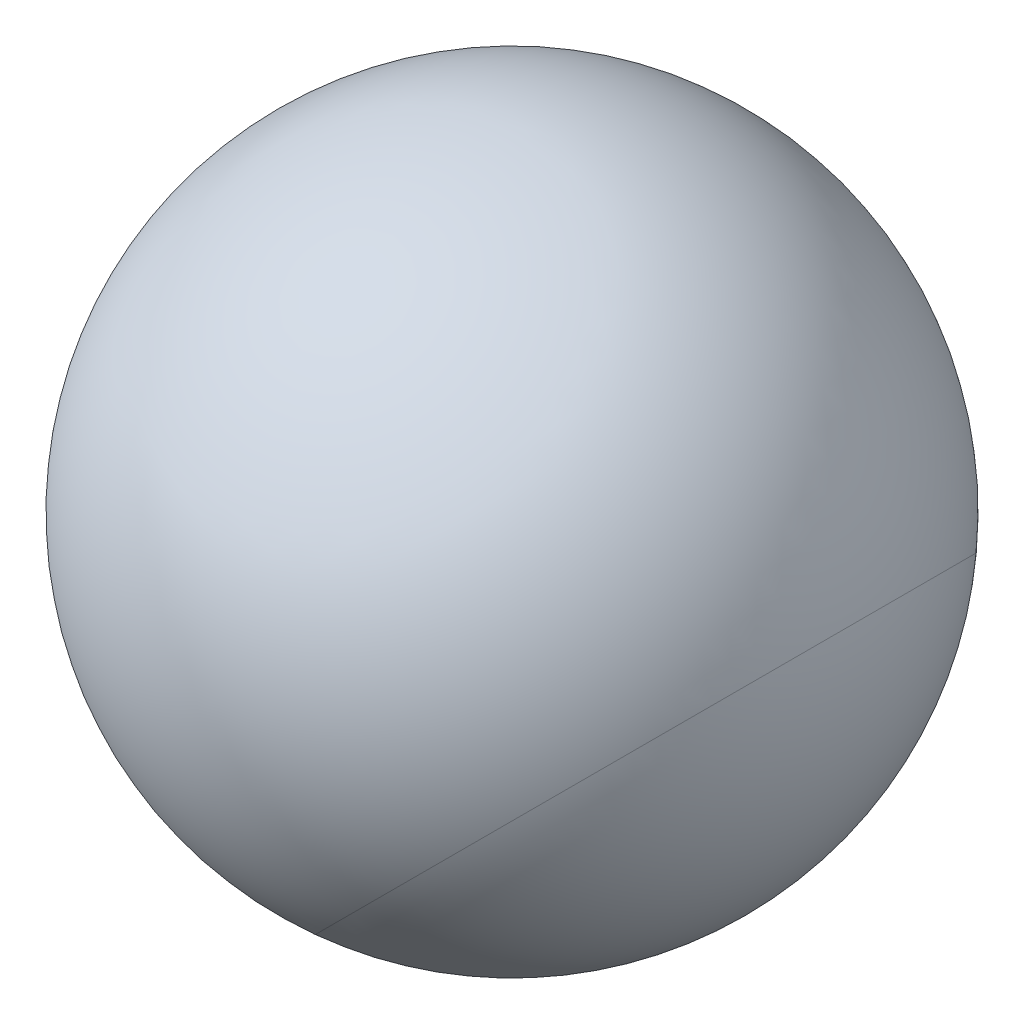
ISO-10303-21;
HEADER;
FILE_DESCRIPTION(('STEP AP214'),'2;1');
FILE_NAME('part.step','',(''),(''),'','','');
FILE_SCHEMA(('AUTOMOTIVE_DESIGN { 1 0 10303 214 1 1 1 1 }'));
ENDSEC;
DATA;
#1=APPLICATION_CONTEXT('core data for automotive mechanical design processes');
#2=APPLICATION_PROTOCOL_DEFINITION('international standard','automotive_design',2000,#1);
#3=PRODUCT_CONTEXT('',#1,'mechanical');
#4=PRODUCT('Part','Part','',(#3));
#5=PRODUCT_RELATED_PRODUCT_CATEGORY('part','',(#4));
#6=PRODUCT_DEFINITION_FORMATION('','',#4);
#7=PRODUCT_DEFINITION_CONTEXT('part definition',#1,'design');
#8=PRODUCT_DEFINITION('design','',#6,#7);
#9=PRODUCT_DEFINITION_SHAPE('','',#8);
#10=(LENGTH_UNIT() NAMED_UNIT(*) SI_UNIT(.MILLI.,.METRE.));
#11=(NAMED_UNIT(*) PLANE_ANGLE_UNIT() SI_UNIT($,.RADIAN.));
#12=(NAMED_UNIT(*) SI_UNIT($,.STERADIAN.) SOLID_ANGLE_UNIT());
#13=UNCERTAINTY_MEASURE_WITH_UNIT(LENGTH_MEASURE(1.E-05),#10,'distance_accuracy_value','');
#14=(GEOMETRIC_REPRESENTATION_CONTEXT(3) GLOBAL_UNCERTAINTY_ASSIGNED_CONTEXT((#13)) GLOBAL_UNIT_ASSIGNED_CONTEXT((#10,
#11,#12)) REPRESENTATION_CONTEXT('',''));
#15=CARTESIAN_POINT('',(0.,0.,0.));
#16=DIRECTION('',(0.,0.,1.));
#17=DIRECTION('',(1.,0.,0.));
#18=AXIS2_PLACEMENT_3D('',#15,#16,#17);
#19=CARTESIAN_POINT('',(0.,0.,0.));
#20=DIRECTION('',(0.707106781186546,-0.707106781186549,0.));
#21=DIRECTION('',(0.707106781186549,0.707106781186546,0.));
#22=AXIS2_PLACEMENT_3D('',#19,#20,#21);
#23=PLANE('',#22);
#24=CARTESIAN_POINT('',(19.912019584716,19.9120195847159,0.));
#25=DIRECTION('',(0.707106781186546,-0.707106781186549,0.));
#26=DIRECTION('',(0.707106781186549,0.707106781186546,0.));
#27=AXIS2_PLACEMENT_3D('',#24,#25,#26);
#28=CIRCLE('',#27,16.6387814422879);
#29=CARTESIAN_POINT('',(31.6774147732387,31.6774147732386,0.));
#30=VERTEX_POINT('',#29);
#31=EDGE_CURVE('E12',#30,#30,#28,.T.);
#32=ORIENTED_EDGE('',*,*,#31,.T.);
#33=EDGE_LOOP('',(#32));
#34=FACE_BOUND('',#33,.T.);
#35=ADVANCED_FACE('F71',(#34),#23,.T.);
#36=CARTESIAN_POINT('',(11.664191018488,28.159848150944,0.));
#37=DIRECTION('',(-0.382683432365091,-0.923879532511287,0.));
#38=DIRECTION('',(-0.923879532511287,0.382683432365091,0.));
#39=AXIS2_PLACEMENT_3D('',#36,#37,#38);
#40=SPHERICAL_SURFACE('',#39,20.32);
#41=CARTESIAN_POINT('',(11.664191018488,28.159848150944,0.));
#42=DIRECTION('',(0.707106781186546,-0.707106781186549,0.));
#43=DIRECTION('',(0.707106781186549,0.707106781186546,0.));
#44=AXIS2_PLACEMENT_3D('',#41,#42,#43);
#45=SPHERICAL_SURFACE('',#44,20.32);
#46=ORIENTED_EDGE('',*,*,#31,.F.);
#47=EDGE_LOOP('',(#46));
#48=FACE_BOUND('',#47,.T.);
#49=ADVANCED_FACE('F79',(#48),#45,.T.);
#50=CLOSED_SHELL('',(#35,#49));
#51=MANIFOLD_SOLID_BREP('B2',#50);
#52=CARTESIAN_POINT('',(0.,0.,0.));
#53=DIRECTION('',(0.707106781186546,-0.707106781186549,0.));
#54=DIRECTION('',(0.707106781186549,0.707106781186546,0.));
#55=AXIS2_PLACEMENT_3D('',#52,#53,#54);
#56=PLANE('',#55);
#57=CARTESIAN_POINT('',(19.912019584716,19.9120195847159,0.));
#58=DIRECTION('',(0.707106781186546,-0.707106781186549,0.));
#59=DIRECTION('',(0.707106781186549,0.707106781186546,0.));
#60=AXIS2_PLACEMENT_3D('',#57,#58,#59);
#61=CIRCLE('',#60,16.6387814422879);
#62=CARTESIAN_POINT('',(31.6774147732387,31.6774147732386,0.));
#63=VERTEX_POINT('',#62);
#64=EDGE_CURVE('E70',#63,#63,#61,.T.);
#65=ORIENTED_EDGE('',*,*,#64,.F.);
#66=EDGE_LOOP('',(#65));
#67=FACE_BOUND('',#66,.T.);
#68=ADVANCED_FACE('F97',(#67),#56,.F.);
#69=CARTESIAN_POINT('',(11.664191018488,28.159848150944,0.));
#70=DIRECTION('',(-0.382683432365091,-0.923879532511287,0.));
#71=DIRECTION('',(-0.923879532511287,0.382683432365091,0.));
#72=AXIS2_PLACEMENT_3D('',#69,#70,#71);
#73=SPHERICAL_SURFACE('',#72,20.32);
#74=CARTESIAN_POINT('',(11.664191018488,28.159848150944,0.));
#75=DIRECTION('',(0.707106781186546,-0.707106781186549,0.));
#76=DIRECTION('',(0.707106781186549,0.707106781186546,0.));
#77=AXIS2_PLACEMENT_3D('',#74,#75,#76);
#78=SPHERICAL_SURFACE('',#77,20.32);
#79=ORIENTED_EDGE('',*,*,#64,.T.);
#80=EDGE_LOOP('',(#79));
#81=FACE_BOUND('',#80,.T.);
#82=ADVANCED_FACE('F104',(#81),#78,.T.);
#83=CLOSED_SHELL('',(#68,#82));
#84=MANIFOLD_SOLID_BREP('B7',#83);
#85=ADVANCED_BREP_SHAPE_REPRESENTATION('',(#18,#51,#84),#14);
#86=SHAPE_DEFINITION_REPRESENTATION(#9,#85);
ENDSEC;
END-ISO-10303-21;
